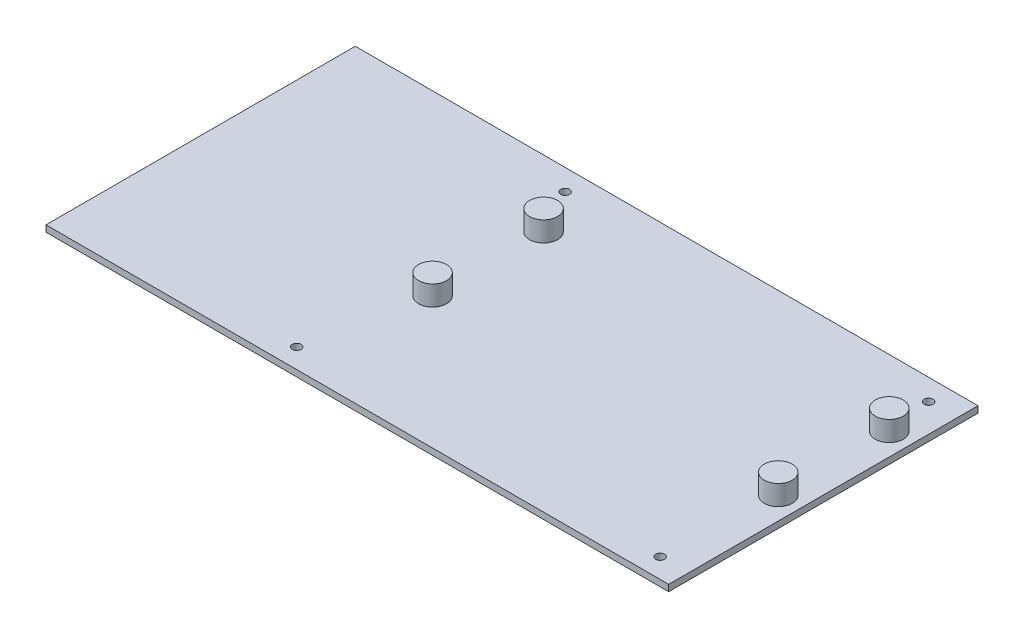
ISO-10303-21;
HEADER;
FILE_DESCRIPTION(('STEP AP214'),'2;1');
FILE_NAME('part.step','',(''),(''),'','','');
FILE_SCHEMA(('AUTOMOTIVE_DESIGN { 1 0 10303 214 1 1 1 1 }'));
ENDSEC;
DATA;
#1=APPLICATION_CONTEXT('core data for automotive mechanical design processes');
#2=APPLICATION_PROTOCOL_DEFINITION('international standard','automotive_design',2000,#1);
#3=PRODUCT_CONTEXT('',#1,'mechanical');
#4=PRODUCT('Part','Part','',(#3));
#5=PRODUCT_RELATED_PRODUCT_CATEGORY('part','',(#4));
#6=PRODUCT_DEFINITION_FORMATION('','',#4);
#7=PRODUCT_DEFINITION_CONTEXT('part definition',#1,'design');
#8=PRODUCT_DEFINITION('design','',#6,#7);
#9=PRODUCT_DEFINITION_SHAPE('','',#8);
#10=(LENGTH_UNIT() NAMED_UNIT(*) SI_UNIT(.MILLI.,.METRE.));
#11=(NAMED_UNIT(*) PLANE_ANGLE_UNIT() SI_UNIT($,.RADIAN.));
#12=(NAMED_UNIT(*) SI_UNIT($,.STERADIAN.) SOLID_ANGLE_UNIT());
#13=UNCERTAINTY_MEASURE_WITH_UNIT(LENGTH_MEASURE(1.E-05),#10,'distance_accuracy_value','');
#14=(GEOMETRIC_REPRESENTATION_CONTEXT(3) GLOBAL_UNCERTAINTY_ASSIGNED_CONTEXT((#13)) GLOBAL_UNIT_ASSIGNED_CONTEXT((#10,
#11,#12)) REPRESENTATION_CONTEXT('',''));
#15=CARTESIAN_POINT('',(0.,0.,0.));
#16=DIRECTION('',(0.,0.,1.));
#17=DIRECTION('',(1.,0.,0.));
#18=AXIS2_PLACEMENT_3D('',#15,#16,#17);
#19=CARTESIAN_POINT('',(0.,1.6,0.));
#20=DIRECTION('',(1.,0.,0.));
#21=DIRECTION('',(0.,0.,-1.));
#22=AXIS2_PLACEMENT_3D('',#19,#20,#21);
#23=PLANE('',#22);
#24=DIRECTION('',(0.,0.,1.));
#25=VECTOR('',#24,1.);
#26=CARTESIAN_POINT('',(0.,0.,0.));
#27=LINE('',#26,#25);
#28=CARTESIAN_POINT('',(0.,0.,0.));
#29=VERTEX_POINT('',#28);
#30=CARTESIAN_POINT('',(0.,0.,77.));
#31=VERTEX_POINT('',#30);
#32=EDGE_CURVE('E104',#29,#31,#27,.T.);
#33=ORIENTED_EDGE('',*,*,#32,.T.);
#34=DIRECTION('',(0.,-1.,0.));
#35=VECTOR('',#34,1.);
#36=CARTESIAN_POINT('',(0.,1.6,77.));
#37=LINE('',#36,#35);
#38=CARTESIAN_POINT('',(0.,1.6,77.));
#39=VERTEX_POINT('',#38);
#40=EDGE_CURVE('E95',#39,#31,#37,.T.);
#41=ORIENTED_EDGE('',*,*,#40,.F.);
#42=DIRECTION('',(0.,0.,1.));
#43=VECTOR('',#42,1.);
#44=CARTESIAN_POINT('',(0.,1.6,0.));
#45=LINE('',#44,#43);
#46=CARTESIAN_POINT('',(0.,1.6,0.));
#47=VERTEX_POINT('',#46);
#48=EDGE_CURVE('E89',#47,#39,#45,.T.);
#49=ORIENTED_EDGE('',*,*,#48,.F.);
#50=DIRECTION('',(0.,-1.,0.));
#51=VECTOR('',#50,1.);
#52=CARTESIAN_POINT('',(0.,1.6,0.));
#53=LINE('',#52,#51);
#54=EDGE_CURVE('E100',#47,#29,#53,.T.);
#55=ORIENTED_EDGE('',*,*,#54,.T.);
#56=EDGE_LOOP('',(#33,#41,#49,#55));
#57=FACE_BOUND('',#56,.T.);
#58=ADVANCED_FACE('F37',(#57),#23,.F.);
#59=CARTESIAN_POINT('',(0.,1.6,77.));
#60=DIRECTION('',(0.,0.,-1.));
#61=DIRECTION('',(-1.,0.,0.));
#62=AXIS2_PLACEMENT_3D('',#59,#60,#61);
#63=PLANE('',#62);
#64=DIRECTION('',(1.,0.,0.));
#65=VECTOR('',#64,1.);
#66=CARTESIAN_POINT('',(0.,0.,77.));
#67=LINE('',#66,#65);
#68=CARTESIAN_POINT('',(155.,0.,77.));
#69=VERTEX_POINT('',#68);
#70=EDGE_CURVE('E94',#31,#69,#67,.T.);
#71=ORIENTED_EDGE('',*,*,#70,.T.);
#72=DIRECTION('',(0.,-1.,0.));
#73=VECTOR('',#72,1.);
#74=CARTESIAN_POINT('',(155.,1.6,77.));
#75=LINE('',#74,#73);
#76=CARTESIAN_POINT('',(155.,1.6,77.));
#77=VERTEX_POINT('',#76);
#78=EDGE_CURVE('E92',#77,#69,#75,.T.);
#79=ORIENTED_EDGE('',*,*,#78,.F.);
#80=DIRECTION('',(1.,0.,0.));
#81=VECTOR('',#80,1.);
#82=CARTESIAN_POINT('',(0.,1.6,77.));
#83=LINE('',#82,#81);
#84=EDGE_CURVE('E84',#39,#77,#83,.T.);
#85=ORIENTED_EDGE('',*,*,#84,.F.);
#86=ORIENTED_EDGE('',*,*,#40,.T.);
#87=EDGE_LOOP('',(#71,#79,#85,#86));
#88=FACE_BOUND('',#87,.T.);
#89=ADVANCED_FACE('F93',(#88),#63,.F.);
#90=CARTESIAN_POINT('',(155.,1.6,0.));
#91=DIRECTION('',(-1.,0.,0.));
#92=DIRECTION('',(0.,0.,1.));
#93=AXIS2_PLACEMENT_3D('',#90,#91,#92);
#94=PLANE('',#93);
#95=DIRECTION('',(0.,0.,-1.));
#96=VECTOR('',#95,1.);
#97=CARTESIAN_POINT('',(155.,0.,0.));
#98=LINE('',#97,#96);
#99=CARTESIAN_POINT('',(155.,0.,0.));
#100=VERTEX_POINT('',#99);
#101=EDGE_CURVE('E70',#69,#100,#98,.T.);
#102=ORIENTED_EDGE('',*,*,#101,.T.);
#103=DIRECTION('',(0.,-1.,0.));
#104=VECTOR('',#103,1.);
#105=CARTESIAN_POINT('',(155.,1.6,0.));
#106=LINE('',#105,#104);
#107=CARTESIAN_POINT('',(155.,1.6,0.));
#108=VERTEX_POINT('',#107);
#109=EDGE_CURVE('E96',#108,#100,#106,.T.);
#110=ORIENTED_EDGE('',*,*,#109,.F.);
#111=DIRECTION('',(0.,0.,-1.));
#112=VECTOR('',#111,1.);
#113=CARTESIAN_POINT('',(155.,1.6,0.));
#114=LINE('',#113,#112);
#115=EDGE_CURVE('E87',#77,#108,#114,.T.);
#116=ORIENTED_EDGE('',*,*,#115,.F.);
#117=ORIENTED_EDGE('',*,*,#78,.T.);
#118=EDGE_LOOP('',(#102,#110,#116,#117));
#119=FACE_BOUND('',#118,.T.);
#120=ADVANCED_FACE('F98',(#119),#94,.F.);
#121=CARTESIAN_POINT('',(0.,1.6,0.));
#122=DIRECTION('',(0.,0.,1.));
#123=DIRECTION('',(1.,0.,0.));
#124=AXIS2_PLACEMENT_3D('',#121,#122,#123);
#125=PLANE('',#124);
#126=DIRECTION('',(-1.,0.,0.));
#127=VECTOR('',#126,1.);
#128=CARTESIAN_POINT('',(0.,0.,0.));
#129=LINE('',#128,#127);
#130=EDGE_CURVE('E76',#100,#29,#129,.T.);
#131=ORIENTED_EDGE('',*,*,#130,.T.);
#132=ORIENTED_EDGE('',*,*,#54,.F.);
#133=DIRECTION('',(-1.,0.,0.));
#134=VECTOR('',#133,1.);
#135=CARTESIAN_POINT('',(0.,1.6,0.));
#136=LINE('',#135,#134);
#137=EDGE_CURVE('E53',#108,#47,#136,.T.);
#138=ORIENTED_EDGE('',*,*,#137,.F.);
#139=ORIENTED_EDGE('',*,*,#109,.T.);
#140=EDGE_LOOP('',(#131,#132,#138,#139));
#141=FACE_BOUND('',#140,.T.);
#142=ADVANCED_FACE('F121',(#141),#125,.F.);
#143=CARTESIAN_POINT('',(0.,1.6,0.));
#144=DIRECTION('',(0.,1.,0.));
#145=DIRECTION('',(0.,0.,1.));
#146=AXIS2_PLACEMENT_3D('',#143,#144,#145);
#147=PLANE('',#146);
#148=CARTESIAN_POINT('',(147.994644580618,1.6,5.28168418880972));
#149=DIRECTION('',(0.,1.,0.));
#150=DIRECTION('',(0.,0.,1.));
#151=AXIS2_PLACEMENT_3D('',#148,#149,#150);
#152=CIRCLE('',#151,1.09999999999999);
#153=CARTESIAN_POINT('',(147.994644580618,1.6,6.38168418880971));
#154=VERTEX_POINT('',#153);
#155=EDGE_CURVE('E165',#154,#154,#152,.T.);
#156=ORIENTED_EDGE('',*,*,#155,.F.);
#157=EDGE_LOOP('',(#156));
#158=FACE_BOUND('',#157,.T.);
#159=CARTESIAN_POINT('',(147.994644580618,1.6,72.1142745514815));
#160=DIRECTION('',(0.,1.,0.));
#161=DIRECTION('',(0.,0.,1.));
#162=AXIS2_PLACEMENT_3D('',#159,#160,#161);
#163=CIRCLE('',#162,1.09999999999999);
#164=CARTESIAN_POINT('',(147.994644580618,1.6,73.2142745514815));
#165=VERTEX_POINT('',#164);
#166=EDGE_CURVE('E159',#165,#165,#163,.T.);
#167=ORIENTED_EDGE('',*,*,#166,.F.);
#168=EDGE_LOOP('',(#167));
#169=FACE_BOUND('',#168,.T.);
#170=CARTESIAN_POINT('',(57.4975961517866,1.6,72.1142745514815));
#171=DIRECTION('',(0.,1.,0.));
#172=DIRECTION('',(0.,0.,1.));
#173=AXIS2_PLACEMENT_3D('',#170,#171,#172);
#174=CIRCLE('',#173,1.09999999999999);
#175=CARTESIAN_POINT('',(57.4975961517866,1.6,73.2142745514815));
#176=VERTEX_POINT('',#175);
#177=EDGE_CURVE('E153',#176,#176,#174,.T.);
#178=ORIENTED_EDGE('',*,*,#177,.F.);
#179=EDGE_LOOP('',(#178));
#180=FACE_BOUND('',#179,.T.);
#181=CARTESIAN_POINT('',(57.4975961517866,1.6,5.28168418880972));
#182=DIRECTION('',(0.,1.,0.));
#183=DIRECTION('',(0.,0.,1.));
#184=AXIS2_PLACEMENT_3D('',#181,#182,#183);
#185=CIRCLE('',#184,1.09999999999999);
#186=CARTESIAN_POINT('',(57.4975961517866,1.6,6.38168418880971));
#187=VERTEX_POINT('',#186);
#188=EDGE_CURVE('E147',#187,#187,#185,.T.);
#189=ORIENTED_EDGE('',*,*,#188,.F.);
#190=EDGE_LOOP('',(#189));
#191=FACE_BOUND('',#190,.T.);
#192=CARTESIAN_POINT('',(149.449734358209,1.6,44.1680867216512));
#193=DIRECTION('',(0.,1.,0.));
#194=DIRECTION('',(0.,0.,1.));
#195=AXIS2_PLACEMENT_3D('',#192,#193,#194);
#196=CIRCLE('',#195,3.47579734962652);
#197=CARTESIAN_POINT('',(149.449734358209,1.6,47.6438840712777));
#198=VERTEX_POINT('',#197);
#199=EDGE_CURVE('E139',#198,#198,#196,.T.);
#200=ORIENTED_EDGE('',*,*,#199,.F.);
#201=EDGE_LOOP('',(#200));
#202=FACE_BOUND('',#201,.T.);
#203=CARTESIAN_POINT('',(149.449734358209,1.6,16.5383132783488));
#204=DIRECTION('',(0.,1.,0.));
#205=DIRECTION('',(0.,0.,1.));
#206=AXIS2_PLACEMENT_3D('',#203,#204,#205);
#207=CIRCLE('',#206,3.47579734962652);
#208=CARTESIAN_POINT('',(149.449734358209,1.6,20.0141106279753));
#209=VERTEX_POINT('',#208);
#210=EDGE_CURVE('E11',#209,#209,#207,.T.);
#211=ORIENTED_EDGE('',*,*,#210,.F.);
#212=EDGE_LOOP('',(#211));
#213=FACE_BOUND('',#212,.T.);
#214=CARTESIAN_POINT('',(63.3988656417919,1.6,44.1680867216512));
#215=DIRECTION('',(0.,1.,0.));
#216=DIRECTION('',(0.,0.,1.));
#217=AXIS2_PLACEMENT_3D('',#214,#215,#216);
#218=CIRCLE('',#217,3.47579734962652);
#219=CARTESIAN_POINT('',(63.3988656417919,1.6,47.6438840712778));
#220=VERTEX_POINT('',#219);
#221=EDGE_CURVE('E45',#220,#220,#218,.T.);
#222=ORIENTED_EDGE('',*,*,#221,.F.);
#223=EDGE_LOOP('',(#222));
#224=FACE_BOUND('',#223,.T.);
#225=CARTESIAN_POINT('',(63.3988656417919,1.6,16.5383132783488));
#226=DIRECTION('',(0.,1.,0.));
#227=DIRECTION('',(0.,0.,1.));
#228=AXIS2_PLACEMENT_3D('',#225,#226,#227);
#229=CIRCLE('',#228,3.47579734962652);
#230=CARTESIAN_POINT('',(63.3988656417919,1.6,20.0141106279753));
#231=VERTEX_POINT('',#230);
#232=EDGE_CURVE('E126',#231,#231,#229,.T.);
#233=ORIENTED_EDGE('',*,*,#232,.F.);
#234=EDGE_LOOP('',(#233));
#235=FACE_BOUND('',#234,.T.);
#236=ORIENTED_EDGE('',*,*,#48,.T.);
#237=ORIENTED_EDGE('',*,*,#84,.T.);
#238=ORIENTED_EDGE('',*,*,#115,.T.);
#239=ORIENTED_EDGE('',*,*,#137,.T.);
#240=EDGE_LOOP('',(#236,#237,#238,#239));
#241=FACE_BOUND('',#240,.T.);
#242=ADVANCED_FACE('F85',(#158,#169,#180,#191,#202,#213,#224,#235,#241),#147,.T.);
#243=CARTESIAN_POINT('',(0.,0.,0.));
#244=DIRECTION('',(0.,1.,0.));
#245=DIRECTION('',(0.,0.,1.));
#246=AXIS2_PLACEMENT_3D('',#243,#244,#245);
#247=PLANE('',#246);
#248=CARTESIAN_POINT('',(147.994644580618,0.,5.28168418880972));
#249=DIRECTION('',(0.,1.,0.));
#250=DIRECTION('',(0.,0.,1.));
#251=AXIS2_PLACEMENT_3D('',#248,#249,#250);
#252=CIRCLE('',#251,1.09999999999999);
#253=CARTESIAN_POINT('',(147.994644580618,0.,6.38168418880971));
#254=VERTEX_POINT('',#253);
#255=EDGE_CURVE('E162',#254,#254,#252,.T.);
#256=ORIENTED_EDGE('',*,*,#255,.T.);
#257=EDGE_LOOP('',(#256));
#258=FACE_BOUND('',#257,.T.);
#259=CARTESIAN_POINT('',(147.994644580618,0.,72.1142745514815));
#260=DIRECTION('',(0.,1.,0.));
#261=DIRECTION('',(0.,0.,1.));
#262=AXIS2_PLACEMENT_3D('',#259,#260,#261);
#263=CIRCLE('',#262,1.09999999999999);
#264=CARTESIAN_POINT('',(147.994644580618,0.,73.2142745514815));
#265=VERTEX_POINT('',#264);
#266=EDGE_CURVE('E156',#265,#265,#263,.T.);
#267=ORIENTED_EDGE('',*,*,#266,.T.);
#268=EDGE_LOOP('',(#267));
#269=FACE_BOUND('',#268,.T.);
#270=CARTESIAN_POINT('',(57.4975961517866,0.,72.1142745514815));
#271=DIRECTION('',(0.,1.,0.));
#272=DIRECTION('',(0.,0.,1.));
#273=AXIS2_PLACEMENT_3D('',#270,#271,#272);
#274=CIRCLE('',#273,1.1);
#275=CARTESIAN_POINT('',(57.4975961517866,0.,73.2142745514815));
#276=VERTEX_POINT('',#275);
#277=EDGE_CURVE('E150',#276,#276,#274,.T.);
#278=ORIENTED_EDGE('',*,*,#277,.T.);
#279=EDGE_LOOP('',(#278));
#280=FACE_BOUND('',#279,.T.);
#281=CARTESIAN_POINT('',(57.4975961517866,0.,5.28168418880972));
#282=DIRECTION('',(0.,1.,0.));
#283=DIRECTION('',(0.,0.,1.));
#284=AXIS2_PLACEMENT_3D('',#281,#282,#283);
#285=CIRCLE('',#284,1.1);
#286=CARTESIAN_POINT('',(57.4975961517866,0.,6.38168418880972));
#287=VERTEX_POINT('',#286);
#288=EDGE_CURVE('E142',#287,#287,#285,.T.);
#289=ORIENTED_EDGE('',*,*,#288,.T.);
#290=EDGE_LOOP('',(#289));
#291=FACE_BOUND('',#290,.T.);
#292=ORIENTED_EDGE('',*,*,#32,.F.);
#293=ORIENTED_EDGE('',*,*,#130,.F.);
#294=ORIENTED_EDGE('',*,*,#101,.F.);
#295=ORIENTED_EDGE('',*,*,#70,.F.);
#296=EDGE_LOOP('',(#292,#293,#294,#295));
#297=FACE_BOUND('',#296,.T.);
#298=ADVANCED_FACE('F120',(#258,#269,#280,#291,#297),#247,.F.);
#299=CARTESIAN_POINT('',(63.3988656417919,6.6,16.5383132783488));
#300=DIRECTION('',(0.,-1.,0.));
#301=DIRECTION('',(0.,0.,-1.));
#302=AXIS2_PLACEMENT_3D('',#299,#300,#301);
#303=CYLINDRICAL_SURFACE('',#302,3.47579734962652);
#304=CARTESIAN_POINT('',(63.3988656417919,6.6,16.5383132783488));
#305=DIRECTION('',(0.,1.,0.));
#306=DIRECTION('',(0.,0.,1.));
#307=AXIS2_PLACEMENT_3D('',#304,#305,#306);
#308=CIRCLE('',#307,3.47579734962652);
#309=CARTESIAN_POINT('',(63.3988656417919,6.6,20.0141106279753));
#310=VERTEX_POINT('',#309);
#311=EDGE_CURVE('E107',#310,#310,#308,.T.);
#312=ORIENTED_EDGE('',*,*,#311,.F.);
#313=EDGE_LOOP('',(#312));
#314=FACE_BOUND('',#313,.T.);
#315=ORIENTED_EDGE('',*,*,#232,.T.);
#316=EDGE_LOOP('',(#315));
#317=FACE_BOUND('',#316,.T.);
#318=ADVANCED_FACE('F204',(#314,#317),#303,.T.);
#319=CARTESIAN_POINT('',(0.,6.6,0.));
#320=DIRECTION('',(0.,1.,0.));
#321=DIRECTION('',(0.,0.,1.));
#322=AXIS2_PLACEMENT_3D('',#319,#320,#321);
#323=PLANE('',#322);
#324=ORIENTED_EDGE('',*,*,#311,.T.);
#325=EDGE_LOOP('',(#324));
#326=FACE_BOUND('',#325,.T.);
#327=ADVANCED_FACE('F210',(#326),#323,.T.);
#328=CARTESIAN_POINT('',(63.3988656417919,6.6,44.1680867216512));
#329=DIRECTION('',(0.,-1.,0.));
#330=DIRECTION('',(0.,0.,-1.));
#331=AXIS2_PLACEMENT_3D('',#328,#329,#330);
#332=CYLINDRICAL_SURFACE('',#331,3.47579734962652);
#333=CARTESIAN_POINT('',(63.3988656417919,6.6,44.1680867216512));
#334=DIRECTION('',(0.,1.,0.));
#335=DIRECTION('',(0.,0.,1.));
#336=AXIS2_PLACEMENT_3D('',#333,#334,#335);
#337=CIRCLE('',#336,3.47579734962652);
#338=CARTESIAN_POINT('',(63.3988656417919,6.6,47.6438840712778));
#339=VERTEX_POINT('',#338);
#340=EDGE_CURVE('E128',#339,#339,#337,.F.);
#341=ORIENTED_EDGE('',*,*,#340,.T.);
#342=EDGE_LOOP('',(#341));
#343=FACE_BOUND('',#342,.T.);
#344=ORIENTED_EDGE('',*,*,#221,.T.);
#345=EDGE_LOOP('',(#344));
#346=FACE_BOUND('',#345,.T.);
#347=ADVANCED_FACE('F116',(#343,#346),#332,.T.);
#348=CARTESIAN_POINT('',(0.,6.6,0.));
#349=DIRECTION('',(0.,1.,0.));
#350=DIRECTION('',(0.,0.,1.));
#351=AXIS2_PLACEMENT_3D('',#348,#349,#350);
#352=PLANE('',#351);
#353=ORIENTED_EDGE('',*,*,#340,.F.);
#354=EDGE_LOOP('',(#353));
#355=FACE_BOUND('',#354,.T.);
#356=ADVANCED_FACE('F184',(#355),#352,.T.);
#357=CARTESIAN_POINT('',(149.449734358209,6.6,16.5383132783488));
#358=DIRECTION('',(0.,-1.,0.));
#359=DIRECTION('',(0.,0.,-1.));
#360=AXIS2_PLACEMENT_3D('',#357,#358,#359);
#361=CYLINDRICAL_SURFACE('',#360,3.47579734962652);
#362=CARTESIAN_POINT('',(149.449734358209,6.6,16.5383132783488));
#363=DIRECTION('',(0.,1.,0.));
#364=DIRECTION('',(0.,0.,1.));
#365=AXIS2_PLACEMENT_3D('',#362,#363,#364);
#366=CIRCLE('',#365,3.47579734962652);
#367=CARTESIAN_POINT('',(149.449734358209,6.6,20.0141106279753));
#368=VERTEX_POINT('',#367);
#369=EDGE_CURVE('E133',#368,#368,#366,.F.);
#370=ORIENTED_EDGE('',*,*,#369,.T.);
#371=EDGE_LOOP('',(#370));
#372=FACE_BOUND('',#371,.T.);
#373=ORIENTED_EDGE('',*,*,#210,.T.);
#374=EDGE_LOOP('',(#373));
#375=FACE_BOUND('',#374,.T.);
#376=ADVANCED_FACE('F181',(#372,#375),#361,.T.);
#377=CARTESIAN_POINT('',(0.,6.6,0.));
#378=DIRECTION('',(0.,1.,0.));
#379=DIRECTION('',(0.,0.,1.));
#380=AXIS2_PLACEMENT_3D('',#377,#378,#379);
#381=PLANE('',#380);
#382=ORIENTED_EDGE('',*,*,#369,.F.);
#383=EDGE_LOOP('',(#382));
#384=FACE_BOUND('',#383,.T.);
#385=ADVANCED_FACE('F183',(#384),#381,.T.);
#386=CARTESIAN_POINT('',(149.449734358209,6.6,44.1680867216512));
#387=DIRECTION('',(0.,-1.,0.));
#388=DIRECTION('',(0.,0.,-1.));
#389=AXIS2_PLACEMENT_3D('',#386,#387,#388);
#390=CYLINDRICAL_SURFACE('',#389,3.47579734962652);
#391=CARTESIAN_POINT('',(149.449734358209,6.6,44.1680867216512));
#392=DIRECTION('',(0.,1.,0.));
#393=DIRECTION('',(0.,0.,1.));
#394=AXIS2_PLACEMENT_3D('',#391,#392,#393);
#395=CIRCLE('',#394,3.47579734962652);
#396=CARTESIAN_POINT('',(149.449734358209,6.6,47.6438840712777));
#397=VERTEX_POINT('',#396);
#398=EDGE_CURVE('E138',#397,#397,#395,.T.);
#399=ORIENTED_EDGE('',*,*,#398,.F.);
#400=EDGE_LOOP('',(#399));
#401=FACE_BOUND('',#400,.T.);
#402=ORIENTED_EDGE('',*,*,#199,.T.);
#403=EDGE_LOOP('',(#402));
#404=FACE_BOUND('',#403,.T.);
#405=ADVANCED_FACE('F191',(#401,#404),#390,.T.);
#406=CARTESIAN_POINT('',(0.,6.6,0.));
#407=DIRECTION('',(0.,1.,0.));
#408=DIRECTION('',(0.,0.,1.));
#409=AXIS2_PLACEMENT_3D('',#406,#407,#408);
#410=PLANE('',#409);
#411=ORIENTED_EDGE('',*,*,#398,.T.);
#412=EDGE_LOOP('',(#411));
#413=FACE_BOUND('',#412,.T.);
#414=ADVANCED_FACE('F237',(#413),#410,.T.);
#415=CARTESIAN_POINT('',(57.4975961517866,1.6,5.28168418880972));
#416=DIRECTION('',(0.,1.,0.));
#417=DIRECTION('',(0.,0.,1.));
#418=AXIS2_PLACEMENT_3D('',#415,#416,#417);
#419=CYLINDRICAL_SURFACE('',#418,1.09999999999999);
#420=ORIENTED_EDGE('',*,*,#288,.F.);
#421=EDGE_LOOP('',(#420));
#422=FACE_BOUND('',#421,.T.);
#423=ORIENTED_EDGE('',*,*,#188,.T.);
#424=EDGE_LOOP('',(#423));
#425=FACE_BOUND('',#424,.T.);
#426=ADVANCED_FACE('F247',(#422,#425),#419,.F.);
#427=CARTESIAN_POINT('',(57.4975961517866,1.6,72.1142745514815));
#428=DIRECTION('',(0.,1.,0.));
#429=DIRECTION('',(0.,0.,1.));
#430=AXIS2_PLACEMENT_3D('',#427,#428,#429);
#431=CYLINDRICAL_SURFACE('',#430,1.09999999999999);
#432=ORIENTED_EDGE('',*,*,#277,.F.);
#433=EDGE_LOOP('',(#432));
#434=FACE_BOUND('',#433,.T.);
#435=ORIENTED_EDGE('',*,*,#177,.T.);
#436=EDGE_LOOP('',(#435));
#437=FACE_BOUND('',#436,.T.);
#438=ADVANCED_FACE('F252',(#434,#437),#431,.F.);
#439=CARTESIAN_POINT('',(147.994644580618,1.6,72.1142745514815));
#440=DIRECTION('',(0.,1.,0.));
#441=DIRECTION('',(0.,0.,1.));
#442=AXIS2_PLACEMENT_3D('',#439,#440,#441);
#443=CYLINDRICAL_SURFACE('',#442,1.09999999999999);
#444=ORIENTED_EDGE('',*,*,#266,.F.);
#445=EDGE_LOOP('',(#444));
#446=FACE_BOUND('',#445,.T.);
#447=ORIENTED_EDGE('',*,*,#166,.T.);
#448=EDGE_LOOP('',(#447));
#449=FACE_BOUND('',#448,.T.);
#450=ADVANCED_FACE('F262',(#446,#449),#443,.F.);
#451=CARTESIAN_POINT('',(147.994644580618,1.6,5.28168418880972));
#452=DIRECTION('',(0.,1.,0.));
#453=DIRECTION('',(0.,0.,1.));
#454=AXIS2_PLACEMENT_3D('',#451,#452,#453);
#455=CYLINDRICAL_SURFACE('',#454,1.09999999999999);
#456=ORIENTED_EDGE('',*,*,#255,.F.);
#457=EDGE_LOOP('',(#456));
#458=FACE_BOUND('',#457,.T.);
#459=ORIENTED_EDGE('',*,*,#155,.T.);
#460=EDGE_LOOP('',(#459));
#461=FACE_BOUND('',#460,.T.);
#462=ADVANCED_FACE('F169',(#458,#461),#455,.F.);
#463=CLOSED_SHELL('',(#58,#89,#120,#142,#242,#298,#318,#327,#347,#356,#376,#385,#405,#414,#426,
#438,#450,#462));
#464=MANIFOLD_SOLID_BREP('B2',#463);
#465=ADVANCED_BREP_SHAPE_REPRESENTATION('',(#18,#464),#14);
#466=SHAPE_DEFINITION_REPRESENTATION(#9,#465);
ENDSEC;
END-ISO-10303-21;
